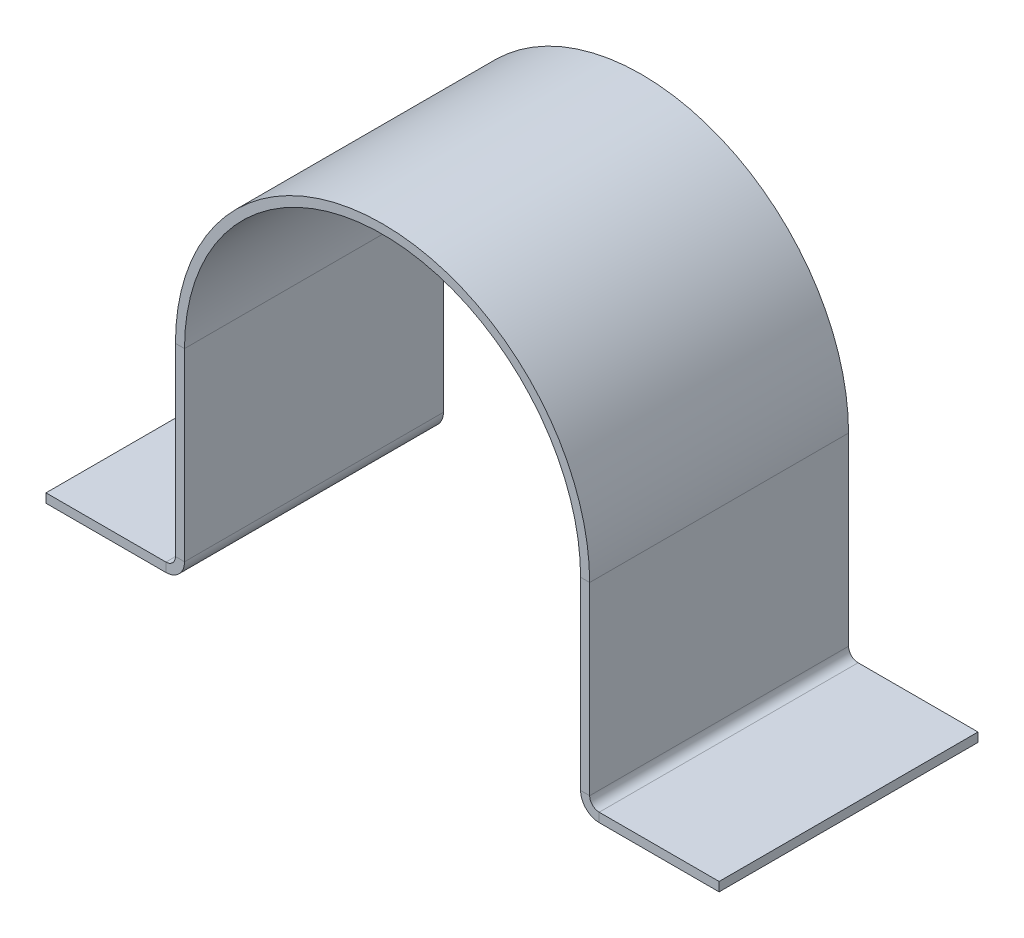
ISO-10303-21;
HEADER;
FILE_DESCRIPTION(('STEP AP214'),'2;1');
FILE_NAME('part.step','',(''),(''),'','','');
FILE_SCHEMA(('AUTOMOTIVE_DESIGN { 1 0 10303 214 1 1 1 1 }'));
ENDSEC;
DATA;
#1=APPLICATION_CONTEXT('core data for automotive mechanical design processes');
#2=APPLICATION_PROTOCOL_DEFINITION('international standard','automotive_design',2000,#1);
#3=PRODUCT_CONTEXT('',#1,'mechanical');
#4=PRODUCT('Part','Part','',(#3));
#5=PRODUCT_RELATED_PRODUCT_CATEGORY('part','',(#4));
#6=PRODUCT_DEFINITION_FORMATION('','',#4);
#7=PRODUCT_DEFINITION_CONTEXT('part definition',#1,'design');
#8=PRODUCT_DEFINITION('design','',#6,#7);
#9=PRODUCT_DEFINITION_SHAPE('','',#8);
#10=(LENGTH_UNIT() NAMED_UNIT(*) SI_UNIT(.MILLI.,.METRE.));
#11=(NAMED_UNIT(*) PLANE_ANGLE_UNIT() SI_UNIT($,.RADIAN.));
#12=(NAMED_UNIT(*) SI_UNIT($,.STERADIAN.) SOLID_ANGLE_UNIT());
#13=UNCERTAINTY_MEASURE_WITH_UNIT(LENGTH_MEASURE(1.E-05),#10,'distance_accuracy_value','');
#14=(GEOMETRIC_REPRESENTATION_CONTEXT(3) GLOBAL_UNCERTAINTY_ASSIGNED_CONTEXT((#13)) GLOBAL_UNIT_ASSIGNED_CONTEXT((#10,
#11,#12)) REPRESENTATION_CONTEXT('',''));
#15=CARTESIAN_POINT('',(0.,0.,0.));
#16=DIRECTION('',(0.,0.,1.));
#17=DIRECTION('',(1.,0.,0.));
#18=AXIS2_PLACEMENT_3D('',#15,#16,#17);
#19=CARTESIAN_POINT('',(17.5726872246696,16.2775330396476,20.));
#20=DIRECTION('',(0.,0.,1.));
#21=DIRECTION('',(1.,0.,0.));
#22=AXIS2_PLACEMENT_3D('',#19,#20,#21);
#23=PLANE('',#22);
#24=DIRECTION('',(-1.,0.,0.));
#25=VECTOR('',#24,1.);
#26=CARTESIAN_POINT('',(17.5726872246696,16.2775330396476,20.));
#27=LINE('',#26,#25);
#28=CARTESIAN_POINT('',(17.5726872246696,16.2775330396476,20.));
#29=VERTEX_POINT('',#28);
#30=CARTESIAN_POINT('',(16.8726872246696,16.2775330396476,20.));
#31=VERTEX_POINT('',#30);
#32=EDGE_CURVE('E11',#29,#31,#27,.T.);
#33=ORIENTED_EDGE('',*,*,#32,.F.);
#34=CARTESIAN_POINT('',(1.5726872246696,16.2775330396476,20.));
#35=DIRECTION('',(0.,0.,-1.));
#36=DIRECTION('',(-1.,0.,0.));
#37=AXIS2_PLACEMENT_3D('',#34,#35,#36);
#38=CIRCLE('',#37,16.);
#39=CARTESIAN_POINT('',(-14.4273127753304,16.2775330396476,20.));
#40=VERTEX_POINT('',#39);
#41=EDGE_CURVE('E302',#40,#29,#38,.T.);
#42=ORIENTED_EDGE('',*,*,#41,.F.);
#43=DIRECTION('',(-1.,0.,0.));
#44=VECTOR('',#43,1.);
#45=CARTESIAN_POINT('',(-13.7273127753304,16.2775330396476,20.));
#46=LINE('',#45,#44);
#47=CARTESIAN_POINT('',(-13.7273127753304,16.2775330396476,20.));
#48=VERTEX_POINT('',#47);
#49=EDGE_CURVE('E45',#48,#40,#46,.T.);
#50=ORIENTED_EDGE('',*,*,#49,.F.);
#51=CARTESIAN_POINT('',(1.5726872246696,16.2775330396476,20.));
#52=DIRECTION('',(0.,0.,1.));
#53=DIRECTION('',(1.,0.,0.));
#54=AXIS2_PLACEMENT_3D('',#51,#52,#53);
#55=CIRCLE('',#54,15.3);
#56=EDGE_CURVE('E170',#48,#31,#55,.F.);
#57=ORIENTED_EDGE('',*,*,#56,.T.);
#58=EDGE_LOOP('',(#33,#42,#50,#57));
#59=FACE_BOUND('',#58,.T.);
#60=ADVANCED_FACE('F37',(#59),#23,.T.);
#61=CARTESIAN_POINT('',(-13.7273127753304,16.2775330396476,20.));
#62=DIRECTION('',(0.,0.,1.));
#63=DIRECTION('',(1.,0.,0.));
#64=AXIS2_PLACEMENT_3D('',#61,#62,#63);
#65=PLANE('',#64);
#66=DIRECTION('',(0.,-1.,0.));
#67=VECTOR('',#66,1.);
#68=CARTESIAN_POINT('',(17.5726872246696,1.27753303964758,20.));
#69=LINE('',#68,#67);
#70=CARTESIAN_POINT('',(17.5726872246696,2.01413303964758,20.));
#71=VERTEX_POINT('',#70);
#72=EDGE_CURVE('E164',#29,#71,#69,.T.);
#73=ORIENTED_EDGE('',*,*,#72,.F.);
#74=ORIENTED_EDGE('',*,*,#32,.T.);
#75=DIRECTION('',(0.,1.,0.));
#76=VECTOR('',#75,1.);
#77=CARTESIAN_POINT('',(16.8726872246696,1.27753303964758,20.));
#78=LINE('',#77,#76);
#79=CARTESIAN_POINT('',(16.8726872246696,2.01413303964758,20.));
#80=VERTEX_POINT('',#79);
#81=EDGE_CURVE('E161',#31,#80,#78,.F.);
#82=ORIENTED_EDGE('',*,*,#81,.T.);
#83=DIRECTION('',(1.,0.,0.));
#84=VECTOR('',#83,1.);
#85=CARTESIAN_POINT('',(16.8726872246696,2.01413303964758,20.));
#86=LINE('',#85,#84);
#87=EDGE_CURVE('E276',#80,#71,#86,.T.);
#88=ORIENTED_EDGE('',*,*,#87,.T.);
#89=EDGE_LOOP('',(#73,#74,#82,#88));
#90=FACE_BOUND('',#89,.T.);
#91=ADVANCED_FACE('F159',(#90),#65,.T.);
#92=CARTESIAN_POINT('',(-14.4273127753304,16.2775330396476,0.));
#93=DIRECTION('',(0.,0.,-1.));
#94=DIRECTION('',(-1.,0.,0.));
#95=AXIS2_PLACEMENT_3D('',#92,#93,#94);
#96=PLANE('',#95);
#97=DIRECTION('',(1.,0.,0.));
#98=VECTOR('',#97,1.);
#99=CARTESIAN_POINT('',(-14.4273127753304,16.2775330396476,0.));
#100=LINE('',#99,#98);
#101=CARTESIAN_POINT('',(-14.4273127753304,16.2775330396476,0.));
#102=VERTEX_POINT('',#101);
#103=CARTESIAN_POINT('',(-13.7273127753304,16.2775330396476,0.));
#104=VERTEX_POINT('',#103);
#105=EDGE_CURVE('E289',#102,#104,#100,.T.);
#106=ORIENTED_EDGE('',*,*,#105,.F.);
#107=CARTESIAN_POINT('',(1.5726872246696,16.2775330396476,0.));
#108=DIRECTION('',(0.,0.,-1.));
#109=DIRECTION('',(-1.,0.,0.));
#110=AXIS2_PLACEMENT_3D('',#107,#108,#109);
#111=CIRCLE('',#110,16.);
#112=CARTESIAN_POINT('',(17.5726872246696,16.2775330396476,0.));
#113=VERTEX_POINT('',#112);
#114=EDGE_CURVE('E209',#102,#113,#111,.T.);
#115=ORIENTED_EDGE('',*,*,#114,.T.);
#116=DIRECTION('',(1.,0.,0.));
#117=VECTOR('',#116,1.);
#118=CARTESIAN_POINT('',(16.8726872246696,16.2775330396476,0.));
#119=LINE('',#118,#117);
#120=CARTESIAN_POINT('',(16.8726872246696,16.2775330396476,0.));
#121=VERTEX_POINT('',#120);
#122=EDGE_CURVE('E287',#121,#113,#119,.T.);
#123=ORIENTED_EDGE('',*,*,#122,.F.);
#124=CARTESIAN_POINT('',(1.5726872246696,16.2775330396476,0.));
#125=DIRECTION('',(0.,0.,1.));
#126=DIRECTION('',(1.,0.,0.));
#127=AXIS2_PLACEMENT_3D('',#124,#125,#126);
#128=CIRCLE('',#127,15.3);
#129=EDGE_CURVE('E182',#104,#121,#128,.F.);
#130=ORIENTED_EDGE('',*,*,#129,.F.);
#131=EDGE_LOOP('',(#106,#115,#123,#130));
#132=FACE_BOUND('',#131,.T.);
#133=ADVANCED_FACE('F336',(#132),#96,.T.);
#134=CARTESIAN_POINT('',(16.8726872246696,16.2775330396476,0.));
#135=DIRECTION('',(0.,0.,-1.));
#136=DIRECTION('',(-1.,0.,0.));
#137=AXIS2_PLACEMENT_3D('',#134,#135,#136);
#138=PLANE('',#137);
#139=DIRECTION('',(0.,1.,0.));
#140=VECTOR('',#139,1.);
#141=CARTESIAN_POINT('',(-14.4273127753304,1.27753303964758,0.));
#142=LINE('',#141,#140);
#143=CARTESIAN_POINT('',(-14.4273127753304,2.01413303964758,0.));
#144=VERTEX_POINT('',#143);
#145=EDGE_CURVE('E212',#144,#102,#142,.T.);
#146=ORIENTED_EDGE('',*,*,#145,.T.);
#147=ORIENTED_EDGE('',*,*,#105,.T.);
#148=DIRECTION('',(0.,1.,0.));
#149=VECTOR('',#148,1.);
#150=CARTESIAN_POINT('',(-13.7273127753304,1.27753303964758,0.));
#151=LINE('',#150,#149);
#152=CARTESIAN_POINT('',(-13.7273127753304,2.01413303964758,0.));
#153=VERTEX_POINT('',#152);
#154=EDGE_CURVE('E230',#153,#104,#151,.T.);
#155=ORIENTED_EDGE('',*,*,#154,.F.);
#156=DIRECTION('',(-1.,0.,0.));
#157=VECTOR('',#156,1.);
#158=CARTESIAN_POINT('',(-13.7273127753304,2.01413303964758,0.));
#159=LINE('',#158,#157);
#160=EDGE_CURVE('E279',#153,#144,#159,.T.);
#161=ORIENTED_EDGE('',*,*,#160,.T.);
#162=EDGE_LOOP('',(#146,#147,#155,#161));
#163=FACE_BOUND('',#162,.T.);
#164=ADVANCED_FACE('F391',(#163),#138,.T.);
#165=CARTESIAN_POINT('',(-14.4273127753304,2.01413303964758,20.));
#166=DIRECTION('',(0.,0.,1.));
#167=DIRECTION('',(1.,0.,0.));
#168=AXIS2_PLACEMENT_3D('',#165,#166,#167);
#169=PLANE('',#168);
#170=DIRECTION('',(1.,0.,0.));
#171=VECTOR('',#170,1.);
#172=CARTESIAN_POINT('',(-14.4273127753304,2.01413303964758,20.));
#173=LINE('',#172,#171);
#174=CARTESIAN_POINT('',(-14.4273127753304,2.01413303964758,20.));
#175=VERTEX_POINT('',#174);
#176=CARTESIAN_POINT('',(-13.7273127753304,2.01413303964758,20.));
#177=VERTEX_POINT('',#176);
#178=EDGE_CURVE('E285',#175,#177,#173,.T.);
#179=ORIENTED_EDGE('',*,*,#178,.F.);
#180=CARTESIAN_POINT('',(-15.1639127753304,2.01413303964758,20.));
#181=DIRECTION('',(0.,0.,-1.));
#182=DIRECTION('',(-1.,0.,0.));
#183=AXIS2_PLACEMENT_3D('',#180,#181,#182);
#184=CIRCLE('',#183,0.7366);
#185=CARTESIAN_POINT('',(-15.1639127753304,1.27753303964758,20.));
#186=VERTEX_POINT('',#185);
#187=EDGE_CURVE('E308',#186,#175,#184,.F.);
#188=ORIENTED_EDGE('',*,*,#187,.F.);
#189=DIRECTION('',(0.,1.,0.));
#190=VECTOR('',#189,1.);
#191=CARTESIAN_POINT('',(-15.1639127753304,0.577533039647578,20.));
#192=LINE('',#191,#190);
#193=CARTESIAN_POINT('',(-15.1639127753304,0.577533039647578,20.));
#194=VERTEX_POINT('',#193);
#195=EDGE_CURVE('E283',#194,#186,#192,.T.);
#196=ORIENTED_EDGE('',*,*,#195,.F.);
#197=CARTESIAN_POINT('',(-15.1639127753304,2.01413303964758,20.));
#198=DIRECTION('',(0.,0.,1.));
#199=DIRECTION('',(1.,0.,0.));
#200=AXIS2_PLACEMENT_3D('',#197,#198,#199);
#201=CIRCLE('',#200,1.4366);
#202=EDGE_CURVE('E322',#194,#177,#201,.T.);
#203=ORIENTED_EDGE('',*,*,#202,.T.);
#204=EDGE_LOOP('',(#179,#188,#196,#203));
#205=FACE_BOUND('',#204,.T.);
#206=ADVANCED_FACE('F327',(#205),#169,.T.);
#207=CARTESIAN_POINT('',(-15.1639127753304,0.577533039647578,20.));
#208=DIRECTION('',(0.,0.,1.));
#209=DIRECTION('',(1.,0.,0.));
#210=AXIS2_PLACEMENT_3D('',#207,#208,#209);
#211=PLANE('',#210);
#212=DIRECTION('',(0.,1.,0.));
#213=VECTOR('',#212,1.);
#214=CARTESIAN_POINT('',(-14.4273127753304,1.27753303964758,20.));
#215=LINE('',#214,#213);
#216=EDGE_CURVE('E295',#175,#40,#215,.T.);
#217=ORIENTED_EDGE('',*,*,#216,.F.);
#218=ORIENTED_EDGE('',*,*,#178,.T.);
#219=DIRECTION('',(0.,1.,0.));
#220=VECTOR('',#219,1.);
#221=CARTESIAN_POINT('',(-13.7273127753304,1.27753303964758,20.));
#222=LINE('',#221,#220);
#223=EDGE_CURVE('E175',#177,#48,#222,.T.);
#224=ORIENTED_EDGE('',*,*,#223,.T.);
#225=ORIENTED_EDGE('',*,*,#49,.T.);
#226=EDGE_LOOP('',(#217,#218,#224,#225));
#227=FACE_BOUND('',#226,.T.);
#228=ADVANCED_FACE('F293',(#227),#211,.T.);
#229=CARTESIAN_POINT('',(-15.1639127753304,1.27753303964758,0.));
#230=DIRECTION('',(0.,0.,-1.));
#231=DIRECTION('',(-1.,0.,0.));
#232=AXIS2_PLACEMENT_3D('',#229,#230,#231);
#233=PLANE('',#232);
#234=DIRECTION('',(0.,-1.,0.));
#235=VECTOR('',#234,1.);
#236=CARTESIAN_POINT('',(-15.1639127753304,1.27753303964758,0.));
#237=LINE('',#236,#235);
#238=CARTESIAN_POINT('',(-15.1639127753304,1.27753303964758,0.));
#239=VERTEX_POINT('',#238);
#240=CARTESIAN_POINT('',(-15.1639127753304,0.577533039647578,0.));
#241=VERTEX_POINT('',#240);
#242=EDGE_CURVE('E281',#239,#241,#237,.T.);
#243=ORIENTED_EDGE('',*,*,#242,.F.);
#244=CARTESIAN_POINT('',(-15.1639127753304,2.01413303964758,0.));
#245=DIRECTION('',(0.,0.,-1.));
#246=DIRECTION('',(-1.,0.,0.));
#247=AXIS2_PLACEMENT_3D('',#244,#245,#246);
#248=CIRCLE('',#247,0.7366);
#249=EDGE_CURVE('E215',#239,#144,#248,.F.);
#250=ORIENTED_EDGE('',*,*,#249,.T.);
#251=ORIENTED_EDGE('',*,*,#160,.F.);
#252=CARTESIAN_POINT('',(-15.1639127753304,2.01413303964758,0.));
#253=DIRECTION('',(0.,0.,1.));
#254=DIRECTION('',(1.,0.,0.));
#255=AXIS2_PLACEMENT_3D('',#252,#253,#254);
#256=CIRCLE('',#255,1.4366);
#257=EDGE_CURVE('E227',#241,#153,#256,.T.);
#258=ORIENTED_EDGE('',*,*,#257,.F.);
#259=EDGE_LOOP('',(#243,#250,#251,#258));
#260=FACE_BOUND('',#259,.T.);
#261=ADVANCED_FACE('F401',(#260),#233,.T.);
#262=CARTESIAN_POINT('',(-13.7273127753304,2.01413303964758,0.));
#263=DIRECTION('',(0.,0.,-1.));
#264=DIRECTION('',(-1.,0.,0.));
#265=AXIS2_PLACEMENT_3D('',#262,#263,#264);
#266=PLANE('',#265);
#267=DIRECTION('',(1.,0.,0.));
#268=VECTOR('',#267,1.);
#269=CARTESIAN_POINT('',(-24.4273127753304,1.27753303964758,0.));
#270=LINE('',#269,#268);
#271=CARTESIAN_POINT('',(-24.4273127753304,1.27753303964758,0.));
#272=VERTEX_POINT('',#271);
#273=EDGE_CURVE('E218',#272,#239,#270,.T.);
#274=ORIENTED_EDGE('',*,*,#273,.T.);
#275=ORIENTED_EDGE('',*,*,#242,.T.);
#276=DIRECTION('',(1.,0.,0.));
#277=VECTOR('',#276,1.);
#278=CARTESIAN_POINT('',(-24.4273127753304,0.577533039647578,0.));
#279=LINE('',#278,#277);
#280=CARTESIAN_POINT('',(-24.4273127753304,0.577533039647578,0.));
#281=VERTEX_POINT('',#280);
#282=EDGE_CURVE('E224',#281,#241,#279,.T.);
#283=ORIENTED_EDGE('',*,*,#282,.F.);
#284=DIRECTION('',(0.,1.,0.));
#285=VECTOR('',#284,1.);
#286=CARTESIAN_POINT('',(-24.4273127753304,0.577533039647578,0.));
#287=LINE('',#286,#285);
#288=EDGE_CURVE('E221',#281,#272,#287,.T.);
#289=ORIENTED_EDGE('',*,*,#288,.T.);
#290=EDGE_LOOP('',(#274,#275,#283,#289));
#291=FACE_BOUND('',#290,.T.);
#292=ADVANCED_FACE('F382',(#291),#266,.T.);
#293=CARTESIAN_POINT('',(18.3092872246696,1.27753303964758,20.));
#294=DIRECTION('',(0.,0.,1.));
#295=DIRECTION('',(1.,0.,0.));
#296=AXIS2_PLACEMENT_3D('',#293,#294,#295);
#297=PLANE('',#296);
#298=DIRECTION('',(0.,-1.,0.));
#299=VECTOR('',#298,1.);
#300=CARTESIAN_POINT('',(18.3092872246696,1.27753303964758,20.));
#301=LINE('',#300,#299);
#302=CARTESIAN_POINT('',(18.3092872246696,1.27753303964758,20.));
#303=VERTEX_POINT('',#302);
#304=CARTESIAN_POINT('',(18.3092872246696,0.577533039647578,20.));
#305=VERTEX_POINT('',#304);
#306=EDGE_CURVE('E53',#303,#305,#301,.T.);
#307=ORIENTED_EDGE('',*,*,#306,.F.);
#308=CARTESIAN_POINT('',(18.3092872246696,2.01413303964758,20.));
#309=DIRECTION('',(0.,0.,-1.));
#310=DIRECTION('',(-1.,0.,0.));
#311=AXIS2_PLACEMENT_3D('',#308,#309,#310);
#312=CIRCLE('',#311,0.7366);
#313=EDGE_CURVE('E366',#71,#303,#312,.F.);
#314=ORIENTED_EDGE('',*,*,#313,.F.);
#315=ORIENTED_EDGE('',*,*,#87,.F.);
#316=CARTESIAN_POINT('',(18.3092872246696,2.01413303964758,20.));
#317=DIRECTION('',(0.,0.,1.));
#318=DIRECTION('',(1.,0.,0.));
#319=AXIS2_PLACEMENT_3D('',#316,#317,#318);
#320=CIRCLE('',#319,1.4366);
#321=EDGE_CURVE('E190',#80,#305,#320,.T.);
#322=ORIENTED_EDGE('',*,*,#321,.T.);
#323=EDGE_LOOP('',(#307,#314,#315,#322));
#324=FACE_BOUND('',#323,.T.);
#325=ADVANCED_FACE('F371',(#324),#297,.T.);
#326=CARTESIAN_POINT('',(16.8726872246696,2.01413303964758,20.));
#327=DIRECTION('',(0.,0.,1.));
#328=DIRECTION('',(1.,0.,0.));
#329=AXIS2_PLACEMENT_3D('',#326,#327,#328);
#330=PLANE('',#329);
#331=DIRECTION('',(1.,0.,0.));
#332=VECTOR('',#331,1.);
#333=CARTESIAN_POINT('',(17.5726872246696,1.27753303964758,20.));
#334=LINE('',#333,#332);
#335=CARTESIAN_POINT('',(27.5726872246696,1.27753303964758,20.));
#336=VERTEX_POINT('',#335);
#337=EDGE_CURVE('E364',#303,#336,#334,.T.);
#338=ORIENTED_EDGE('',*,*,#337,.F.);
#339=ORIENTED_EDGE('',*,*,#306,.T.);
#340=DIRECTION('',(1.,0.,0.));
#341=VECTOR('',#340,1.);
#342=CARTESIAN_POINT('',(17.5726872246696,0.577533039647578,20.));
#343=LINE('',#342,#341);
#344=CARTESIAN_POINT('',(27.5726872246696,0.577533039647578,20.));
#345=VERTEX_POINT('',#344);
#346=EDGE_CURVE('E119',#305,#345,#343,.T.);
#347=ORIENTED_EDGE('',*,*,#346,.T.);
#348=DIRECTION('',(0.,-1.,0.));
#349=VECTOR('',#348,1.);
#350=CARTESIAN_POINT('',(27.5726872246696,1.27753303964758,20.));
#351=LINE('',#350,#349);
#352=EDGE_CURVE('E362',#336,#345,#351,.T.);
#353=ORIENTED_EDGE('',*,*,#352,.F.);
#354=EDGE_LOOP('',(#338,#339,#347,#353));
#355=FACE_BOUND('',#354,.T.);
#356=ADVANCED_FACE('F374',(#355),#330,.T.);
#357=CARTESIAN_POINT('',(17.5726872246696,2.01413303964758,0.));
#358=DIRECTION('',(0.,0.,-1.));
#359=DIRECTION('',(-1.,0.,0.));
#360=AXIS2_PLACEMENT_3D('',#357,#358,#359);
#361=PLANE('',#360);
#362=DIRECTION('',(-1.,0.,0.));
#363=VECTOR('',#362,1.);
#364=CARTESIAN_POINT('',(17.5726872246696,2.01413303964758,0.));
#365=LINE('',#364,#363);
#366=CARTESIAN_POINT('',(17.5726872246696,2.01413303964758,0.));
#367=VERTEX_POINT('',#366);
#368=CARTESIAN_POINT('',(16.8726872246696,2.01413303964758,0.));
#369=VERTEX_POINT('',#368);
#370=EDGE_CURVE('E106',#367,#369,#365,.T.);
#371=ORIENTED_EDGE('',*,*,#370,.F.);
#372=CARTESIAN_POINT('',(18.3092872246696,2.01413303964758,0.));
#373=DIRECTION('',(0.,0.,-1.));
#374=DIRECTION('',(-1.,0.,0.));
#375=AXIS2_PLACEMENT_3D('',#372,#373,#374);
#376=CIRCLE('',#375,0.7366);
#377=CARTESIAN_POINT('',(18.3092872246696,1.27753303964758,0.));
#378=VERTEX_POINT('',#377);
#379=EDGE_CURVE('E205',#367,#378,#376,.F.);
#380=ORIENTED_EDGE('',*,*,#379,.T.);
#381=DIRECTION('',(0.,1.,0.));
#382=VECTOR('',#381,1.);
#383=CARTESIAN_POINT('',(18.3092872246696,0.577533039647578,0.));
#384=LINE('',#383,#382);
#385=CARTESIAN_POINT('',(18.3092872246696,0.577533039647578,0.));
#386=VERTEX_POINT('',#385);
#387=EDGE_CURVE('E113',#386,#378,#384,.T.);
#388=ORIENTED_EDGE('',*,*,#387,.F.);
#389=CARTESIAN_POINT('',(18.3092872246696,2.01413303964758,0.));
#390=DIRECTION('',(0.,0.,1.));
#391=DIRECTION('',(1.,0.,0.));
#392=AXIS2_PLACEMENT_3D('',#389,#390,#391);
#393=CIRCLE('',#392,1.4366);
#394=EDGE_CURVE('E236',#369,#386,#393,.T.);
#395=ORIENTED_EDGE('',*,*,#394,.F.);
#396=EDGE_LOOP('',(#371,#380,#388,#395));
#397=FACE_BOUND('',#396,.T.);
#398=ADVANCED_FACE('F349',(#397),#361,.T.);
#399=CARTESIAN_POINT('',(18.3092872246696,0.577533039647578,0.));
#400=DIRECTION('',(0.,0.,-1.));
#401=DIRECTION('',(-1.,0.,0.));
#402=AXIS2_PLACEMENT_3D('',#399,#400,#401);
#403=PLANE('',#402);
#404=DIRECTION('',(0.,-1.,0.));
#405=VECTOR('',#404,1.);
#406=CARTESIAN_POINT('',(17.5726872246696,1.27753303964758,0.));
#407=LINE('',#406,#405);
#408=EDGE_CURVE('E207',#113,#367,#407,.T.);
#409=ORIENTED_EDGE('',*,*,#408,.T.);
#410=ORIENTED_EDGE('',*,*,#370,.T.);
#411=DIRECTION('',(0.,1.,0.));
#412=VECTOR('',#411,1.);
#413=CARTESIAN_POINT('',(16.8726872246696,1.27753303964758,0.));
#414=LINE('',#413,#412);
#415=EDGE_CURVE('E234',#121,#369,#414,.F.);
#416=ORIENTED_EDGE('',*,*,#415,.F.);
#417=ORIENTED_EDGE('',*,*,#122,.T.);
#418=EDGE_LOOP('',(#409,#410,#416,#417));
#419=FACE_BOUND('',#418,.T.);
#420=ADVANCED_FACE('F337',(#419),#403,.T.);
#421=CARTESIAN_POINT('',(17.5726872246696,0.577533039647578,20.));
#422=DIRECTION('',(0.,1.,0.));
#423=DIRECTION('',(0.,0.,1.));
#424=AXIS2_PLACEMENT_3D('',#421,#422,#423);
#425=PLANE('',#424);
#426=DIRECTION('',(1.,0.,0.));
#427=VECTOR('',#426,1.);
#428=CARTESIAN_POINT('',(17.5726872246696,0.577533039647578,0.));
#429=LINE('',#428,#427);
#430=CARTESIAN_POINT('',(27.5726872246696,0.577533039647578,0.));
#431=VERTEX_POINT('',#430);
#432=EDGE_CURVE('E196',#386,#431,#429,.T.);
#433=ORIENTED_EDGE('',*,*,#432,.T.);
#434=DIRECTION('',(0.,0.,-1.));
#435=VECTOR('',#434,1.);
#436=CARTESIAN_POINT('',(27.5726872246696,0.577533039647578,20.));
#437=LINE('',#436,#435);
#438=EDGE_CURVE('E272',#345,#431,#437,.T.);
#439=ORIENTED_EDGE('',*,*,#438,.F.);
#440=ORIENTED_EDGE('',*,*,#346,.F.);
#441=DIRECTION('',(0.,0.,-1.));
#442=VECTOR('',#441,1.);
#443=CARTESIAN_POINT('',(18.3092872246696,0.577533039647578,20.));
#444=LINE('',#443,#442);
#445=EDGE_CURVE('E192',#305,#386,#444,.T.);
#446=ORIENTED_EDGE('',*,*,#445,.T.);
#447=EDGE_LOOP('',(#433,#439,#440,#446));
#448=FACE_BOUND('',#447,.T.);
#449=ADVANCED_FACE('F355',(#448),#425,.F.);
#450=CARTESIAN_POINT('',(27.5726872246696,1.27753303964758,20.));
#451=DIRECTION('',(1.,0.,0.));
#452=DIRECTION('',(0.,0.,-1.));
#453=AXIS2_PLACEMENT_3D('',#450,#451,#452);
#454=PLANE('',#453);
#455=DIRECTION('',(0.,-1.,0.));
#456=VECTOR('',#455,1.);
#457=CARTESIAN_POINT('',(27.5726872246696,1.27753303964758,0.));
#458=LINE('',#457,#456);
#459=CARTESIAN_POINT('',(27.5726872246696,1.27753303964758,0.));
#460=VERTEX_POINT('',#459);
#461=EDGE_CURVE('E199',#460,#431,#458,.T.);
#462=ORIENTED_EDGE('',*,*,#461,.F.);
#463=DIRECTION('',(0.,0.,-1.));
#464=VECTOR('',#463,1.);
#465=CARTESIAN_POINT('',(27.5726872246696,1.27753303964758,20.));
#466=LINE('',#465,#464);
#467=EDGE_CURVE('E270',#336,#460,#466,.T.);
#468=ORIENTED_EDGE('',*,*,#467,.F.);
#469=ORIENTED_EDGE('',*,*,#352,.T.);
#470=ORIENTED_EDGE('',*,*,#438,.T.);
#471=EDGE_LOOP('',(#462,#468,#469,#470));
#472=FACE_BOUND('',#471,.T.);
#473=ADVANCED_FACE('F360',(#472),#454,.T.);
#474=CARTESIAN_POINT('',(17.5726872246696,1.27753303964758,20.));
#475=DIRECTION('',(0.,1.,0.));
#476=DIRECTION('',(0.,0.,1.));
#477=AXIS2_PLACEMENT_3D('',#474,#475,#476);
#478=PLANE('',#477);
#479=DIRECTION('',(1.,0.,0.));
#480=VECTOR('',#479,1.);
#481=CARTESIAN_POINT('',(17.5726872246696,1.27753303964758,0.));
#482=LINE('',#481,#480);
#483=EDGE_CURVE('E202',#378,#460,#482,.T.);
#484=ORIENTED_EDGE('',*,*,#483,.F.);
#485=DIRECTION('',(0.,0.,-1.));
#486=VECTOR('',#485,1.);
#487=CARTESIAN_POINT('',(18.3092872246696,1.27753303964758,20.));
#488=LINE('',#487,#486);
#489=EDGE_CURVE('E267',#303,#378,#488,.T.);
#490=ORIENTED_EDGE('',*,*,#489,.F.);
#491=ORIENTED_EDGE('',*,*,#337,.T.);
#492=ORIENTED_EDGE('',*,*,#467,.T.);
#493=EDGE_LOOP('',(#484,#490,#491,#492));
#494=FACE_BOUND('',#493,.T.);
#495=ADVANCED_FACE('F373',(#494),#478,.T.);
#496=CARTESIAN_POINT('',(18.3092872246696,2.01413303964758,20.));
#497=DIRECTION('',(0.,0.,-1.));
#498=DIRECTION('',(-1.,0.,0.));
#499=AXIS2_PLACEMENT_3D('',#496,#497,#498);
#500=CYLINDRICAL_SURFACE('',#499,0.7366);
#501=ORIENTED_EDGE('',*,*,#379,.F.);
#502=DIRECTION('',(0.,0.,-1.));
#503=VECTOR('',#502,1.);
#504=CARTESIAN_POINT('',(17.5726872246696,2.01413303964758,20.));
#505=LINE('',#504,#503);
#506=EDGE_CURVE('E264',#71,#367,#505,.T.);
#507=ORIENTED_EDGE('',*,*,#506,.F.);
#508=ORIENTED_EDGE('',*,*,#313,.T.);
#509=ORIENTED_EDGE('',*,*,#489,.T.);
#510=EDGE_LOOP('',(#501,#507,#508,#509));
#511=FACE_BOUND('',#510,.T.);
#512=ADVANCED_FACE('F346',(#511),#500,.F.);
#513=CARTESIAN_POINT('',(17.5726872246696,1.27753303964758,20.));
#514=DIRECTION('',(1.,0.,0.));
#515=DIRECTION('',(0.,0.,-1.));
#516=AXIS2_PLACEMENT_3D('',#513,#514,#515);
#517=PLANE('',#516);
#518=ORIENTED_EDGE('',*,*,#408,.F.);
#519=DIRECTION('',(0.,0.,-1.));
#520=VECTOR('',#519,1.);
#521=CARTESIAN_POINT('',(17.5726872246696,16.2775330396476,20.));
#522=LINE('',#521,#520);
#523=EDGE_CURVE('E261',#29,#113,#522,.T.);
#524=ORIENTED_EDGE('',*,*,#523,.F.);
#525=ORIENTED_EDGE('',*,*,#72,.T.);
#526=ORIENTED_EDGE('',*,*,#506,.T.);
#527=EDGE_LOOP('',(#518,#524,#525,#526));
#528=FACE_BOUND('',#527,.T.);
#529=ADVANCED_FACE('F340',(#528),#517,.T.);
#530=CARTESIAN_POINT('',(1.5726872246696,16.2775330396476,20.));
#531=DIRECTION('',(0.,0.,-1.));
#532=DIRECTION('',(-1.,0.,0.));
#533=AXIS2_PLACEMENT_3D('',#530,#531,#532);
#534=CYLINDRICAL_SURFACE('',#533,16.);
#535=ORIENTED_EDGE('',*,*,#114,.F.);
#536=DIRECTION('',(0.,0.,-1.));
#537=VECTOR('',#536,1.);
#538=CARTESIAN_POINT('',(-14.4273127753304,16.2775330396476,20.));
#539=LINE('',#538,#537);
#540=EDGE_CURVE('E258',#40,#102,#539,.T.);
#541=ORIENTED_EDGE('',*,*,#540,.F.);
#542=ORIENTED_EDGE('',*,*,#41,.T.);
#543=ORIENTED_EDGE('',*,*,#523,.T.);
#544=EDGE_LOOP('',(#535,#541,#542,#543));
#545=FACE_BOUND('',#544,.T.);
#546=ADVANCED_FACE('F301',(#545),#534,.T.);
#547=CARTESIAN_POINT('',(-14.4273127753304,1.27753303964758,20.));
#548=DIRECTION('',(-1.,0.,0.));
#549=DIRECTION('',(0.,0.,1.));
#550=AXIS2_PLACEMENT_3D('',#547,#548,#549);
#551=PLANE('',#550);
#552=ORIENTED_EDGE('',*,*,#145,.F.);
#553=DIRECTION('',(0.,0.,-1.));
#554=VECTOR('',#553,1.);
#555=CARTESIAN_POINT('',(-14.4273127753304,2.01413303964758,20.));
#556=LINE('',#555,#554);
#557=EDGE_CURVE('E255',#175,#144,#556,.T.);
#558=ORIENTED_EDGE('',*,*,#557,.F.);
#559=ORIENTED_EDGE('',*,*,#216,.T.);
#560=ORIENTED_EDGE('',*,*,#540,.T.);
#561=EDGE_LOOP('',(#552,#558,#559,#560));
#562=FACE_BOUND('',#561,.T.);
#563=ADVANCED_FACE('F307',(#562),#551,.T.);
#564=CARTESIAN_POINT('',(-15.1639127753304,2.01413303964758,20.));
#565=DIRECTION('',(0.,0.,-1.));
#566=DIRECTION('',(-1.,0.,0.));
#567=AXIS2_PLACEMENT_3D('',#564,#565,#566);
#568=CYLINDRICAL_SURFACE('',#567,0.7366);
#569=ORIENTED_EDGE('',*,*,#249,.F.);
#570=DIRECTION('',(0.,0.,-1.));
#571=VECTOR('',#570,1.);
#572=CARTESIAN_POINT('',(-15.1639127753304,1.27753303964758,20.));
#573=LINE('',#572,#571);
#574=EDGE_CURVE('E252',#186,#239,#573,.T.);
#575=ORIENTED_EDGE('',*,*,#574,.F.);
#576=ORIENTED_EDGE('',*,*,#187,.T.);
#577=ORIENTED_EDGE('',*,*,#557,.T.);
#578=EDGE_LOOP('',(#569,#575,#576,#577));
#579=FACE_BOUND('',#578,.T.);
#580=ADVANCED_FACE('F418',(#579),#568,.F.);
#581=CARTESIAN_POINT('',(-24.4273127753304,1.27753303964758,20.));
#582=DIRECTION('',(0.,1.,0.));
#583=DIRECTION('',(0.,0.,1.));
#584=AXIS2_PLACEMENT_3D('',#581,#582,#583);
#585=PLANE('',#584);
#586=ORIENTED_EDGE('',*,*,#273,.F.);
#587=DIRECTION('',(0.,0.,-1.));
#588=VECTOR('',#587,1.);
#589=CARTESIAN_POINT('',(-24.4273127753304,1.27753303964758,20.));
#590=LINE('',#589,#588);
#591=CARTESIAN_POINT('',(-24.4273127753304,1.27753303964758,20.));
#592=VERTEX_POINT('',#591);
#593=EDGE_CURVE('E250',#592,#272,#590,.T.);
#594=ORIENTED_EDGE('',*,*,#593,.F.);
#595=DIRECTION('',(1.,0.,0.));
#596=VECTOR('',#595,1.);
#597=CARTESIAN_POINT('',(-24.4273127753304,1.27753303964758,20.));
#598=LINE('',#597,#596);
#599=EDGE_CURVE('E310',#592,#186,#598,.T.);
#600=ORIENTED_EDGE('',*,*,#599,.T.);
#601=ORIENTED_EDGE('',*,*,#574,.T.);
#602=EDGE_LOOP('',(#586,#594,#600,#601));
#603=FACE_BOUND('',#602,.T.);
#604=ADVANCED_FACE('F413',(#603),#585,.T.);
#605=CARTESIAN_POINT('',(-24.4273127753304,0.577533039647578,20.));
#606=DIRECTION('',(-1.,0.,0.));
#607=DIRECTION('',(0.,0.,1.));
#608=AXIS2_PLACEMENT_3D('',#605,#606,#607);
#609=PLANE('',#608);
#610=ORIENTED_EDGE('',*,*,#288,.F.);
#611=DIRECTION('',(0.,0.,-1.));
#612=VECTOR('',#611,1.);
#613=CARTESIAN_POINT('',(-24.4273127753304,0.577533039647578,20.));
#614=LINE('',#613,#612);
#615=CARTESIAN_POINT('',(-24.4273127753304,0.577533039647578,20.));
#616=VERTEX_POINT('',#615);
#617=EDGE_CURVE('E248',#616,#281,#614,.T.);
#618=ORIENTED_EDGE('',*,*,#617,.F.);
#619=DIRECTION('',(0.,1.,0.));
#620=VECTOR('',#619,1.);
#621=CARTESIAN_POINT('',(-24.4273127753304,0.577533039647578,20.));
#622=LINE('',#621,#620);
#623=EDGE_CURVE('E316',#616,#592,#622,.T.);
#624=ORIENTED_EDGE('',*,*,#623,.T.);
#625=ORIENTED_EDGE('',*,*,#593,.T.);
#626=EDGE_LOOP('',(#610,#618,#624,#625));
#627=FACE_BOUND('',#626,.T.);
#628=ADVANCED_FACE('F425',(#627),#609,.T.);
#629=CARTESIAN_POINT('',(-24.4273127753304,0.577533039647578,20.));
#630=DIRECTION('',(0.,1.,0.));
#631=DIRECTION('',(0.,0.,1.));
#632=AXIS2_PLACEMENT_3D('',#629,#630,#631);
#633=PLANE('',#632);
#634=ORIENTED_EDGE('',*,*,#282,.T.);
#635=DIRECTION('',(0.,0.,-1.));
#636=VECTOR('',#635,1.);
#637=CARTESIAN_POINT('',(-15.1639127753304,0.577533039647578,20.));
#638=LINE('',#637,#636);
#639=EDGE_CURVE('E245',#194,#241,#638,.T.);
#640=ORIENTED_EDGE('',*,*,#639,.F.);
#641=DIRECTION('',(1.,0.,0.));
#642=VECTOR('',#641,1.);
#643=CARTESIAN_POINT('',(-24.4273127753304,0.577533039647578,20.));
#644=LINE('',#643,#642);
#645=EDGE_CURVE('E319',#616,#194,#644,.T.);
#646=ORIENTED_EDGE('',*,*,#645,.F.);
#647=ORIENTED_EDGE('',*,*,#617,.T.);
#648=EDGE_LOOP('',(#634,#640,#646,#647));
#649=FACE_BOUND('',#648,.T.);
#650=ADVANCED_FACE('F497',(#649),#633,.F.);
#651=CARTESIAN_POINT('',(-15.1639127753304,2.01413303964758,20.));
#652=DIRECTION('',(0.,0.,-1.));
#653=DIRECTION('',(-1.,0.,0.));
#654=AXIS2_PLACEMENT_3D('',#651,#652,#653);
#655=CYLINDRICAL_SURFACE('',#654,1.4366);
#656=ORIENTED_EDGE('',*,*,#257,.T.);
#657=DIRECTION('',(0.,0.,-1.));
#658=VECTOR('',#657,1.);
#659=CARTESIAN_POINT('',(-13.7273127753304,2.01413303964758,20.));
#660=LINE('',#659,#658);
#661=EDGE_CURVE('E242',#177,#153,#660,.T.);
#662=ORIENTED_EDGE('',*,*,#661,.F.);
#663=ORIENTED_EDGE('',*,*,#202,.F.);
#664=ORIENTED_EDGE('',*,*,#639,.T.);
#665=EDGE_LOOP('',(#656,#662,#663,#664));
#666=FACE_BOUND('',#665,.T.);
#667=ADVANCED_FACE('F330',(#666),#655,.T.);
#668=CARTESIAN_POINT('',(-13.7273127753304,1.27753303964758,20.));
#669=DIRECTION('',(-1.,0.,0.));
#670=DIRECTION('',(0.,0.,1.));
#671=AXIS2_PLACEMENT_3D('',#668,#669,#670);
#672=PLANE('',#671);
#673=ORIENTED_EDGE('',*,*,#154,.T.);
#674=DIRECTION('',(0.,0.,-1.));
#675=VECTOR('',#674,1.);
#676=CARTESIAN_POINT('',(-13.7273127753304,16.2775330396476,20.));
#677=LINE('',#676,#675);
#678=EDGE_CURVE('E184',#48,#104,#677,.T.);
#679=ORIENTED_EDGE('',*,*,#678,.F.);
#680=ORIENTED_EDGE('',*,*,#223,.F.);
#681=ORIENTED_EDGE('',*,*,#661,.T.);
#682=EDGE_LOOP('',(#673,#679,#680,#681));
#683=FACE_BOUND('',#682,.T.);
#684=ADVANCED_FACE('F334',(#683),#672,.F.);
#685=CARTESIAN_POINT('',(1.5726872246696,16.2775330396476,20.));
#686=DIRECTION('',(0.,0.,-1.));
#687=DIRECTION('',(-1.,0.,0.));
#688=AXIS2_PLACEMENT_3D('',#685,#686,#687);
#689=CYLINDRICAL_SURFACE('',#688,15.3);
#690=ORIENTED_EDGE('',*,*,#129,.T.);
#691=DIRECTION('',(0.,0.,-1.));
#692=VECTOR('',#691,1.);
#693=CARTESIAN_POINT('',(16.8726872246696,16.2775330396476,20.));
#694=LINE('',#693,#692);
#695=EDGE_CURVE('E179',#31,#121,#694,.T.);
#696=ORIENTED_EDGE('',*,*,#695,.F.);
#697=ORIENTED_EDGE('',*,*,#56,.F.);
#698=ORIENTED_EDGE('',*,*,#678,.T.);
#699=EDGE_LOOP('',(#690,#696,#697,#698));
#700=FACE_BOUND('',#699,.T.);
#701=ADVANCED_FACE('F180',(#700),#689,.F.);
#702=CARTESIAN_POINT('',(16.8726872246696,1.27753303964758,20.));
#703=DIRECTION('',(1.,0.,0.));
#704=DIRECTION('',(0.,0.,-1.));
#705=AXIS2_PLACEMENT_3D('',#702,#703,#704);
#706=PLANE('',#705);
#707=ORIENTED_EDGE('',*,*,#415,.T.);
#708=DIRECTION('',(0.,0.,-1.));
#709=VECTOR('',#708,1.);
#710=CARTESIAN_POINT('',(16.8726872246696,2.01413303964758,20.));
#711=LINE('',#710,#709);
#712=EDGE_CURVE('E185',#80,#369,#711,.T.);
#713=ORIENTED_EDGE('',*,*,#712,.F.);
#714=ORIENTED_EDGE('',*,*,#81,.F.);
#715=ORIENTED_EDGE('',*,*,#695,.T.);
#716=EDGE_LOOP('',(#707,#713,#714,#715));
#717=FACE_BOUND('',#716,.T.);
#718=ADVANCED_FACE('F187',(#717),#706,.F.);
#719=CARTESIAN_POINT('',(18.3092872246696,2.01413303964758,20.));
#720=DIRECTION('',(0.,0.,-1.));
#721=DIRECTION('',(-1.,0.,0.));
#722=AXIS2_PLACEMENT_3D('',#719,#720,#721);
#723=CYLINDRICAL_SURFACE('',#722,1.4366);
#724=ORIENTED_EDGE('',*,*,#394,.T.);
#725=ORIENTED_EDGE('',*,*,#445,.F.);
#726=ORIENTED_EDGE('',*,*,#321,.F.);
#727=ORIENTED_EDGE('',*,*,#712,.T.);
#728=EDGE_LOOP('',(#724,#725,#726,#727));
#729=FACE_BOUND('',#728,.T.);
#730=ADVANCED_FACE('F352',(#729),#723,.T.);
#731=CARTESIAN_POINT('',(18.3092872246696,2.01413303964758,20.));
#732=DIRECTION('',(0.,0.,-1.));
#733=DIRECTION('',(-1.,0.,0.));
#734=AXIS2_PLACEMENT_3D('',#731,#732,#733);
#735=PLANE('',#734);
#736=ORIENTED_EDGE('',*,*,#645,.T.);
#737=ORIENTED_EDGE('',*,*,#195,.T.);
#738=ORIENTED_EDGE('',*,*,#599,.F.);
#739=ORIENTED_EDGE('',*,*,#623,.F.);
#740=EDGE_LOOP('',(#736,#737,#738,#739));
#741=FACE_BOUND('',#740,.T.);
#742=ADVANCED_FACE('F553',(#741),#735,.F.);
#743=CARTESIAN_POINT('',(18.3092872246696,2.01413303964758,0.));
#744=DIRECTION('',(0.,0.,-1.));
#745=DIRECTION('',(-1.,0.,0.));
#746=AXIS2_PLACEMENT_3D('',#743,#744,#745);
#747=PLANE('',#746);
#748=ORIENTED_EDGE('',*,*,#432,.F.);
#749=ORIENTED_EDGE('',*,*,#387,.T.);
#750=ORIENTED_EDGE('',*,*,#483,.T.);
#751=ORIENTED_EDGE('',*,*,#461,.T.);
#752=EDGE_LOOP('',(#748,#749,#750,#751));
#753=FACE_BOUND('',#752,.T.);
#754=ADVANCED_FACE('F357',(#753),#747,.T.);
#755=CLOSED_SHELL('',(#60,#91,#133,#164,#206,#228,#261,#292,#325,#356,#398,#420,#449,#473,#495,
#512,#529,#546,#563,#580,#604,#628,#650,#667,#684,#701,#718,#730,#742,#754));
#756=MANIFOLD_SOLID_BREP('B2',#755);
#757=ADVANCED_BREP_SHAPE_REPRESENTATION('',(#18,#756),#14);
#758=SHAPE_DEFINITION_REPRESENTATION(#9,#757);
ENDSEC;
END-ISO-10303-21;
